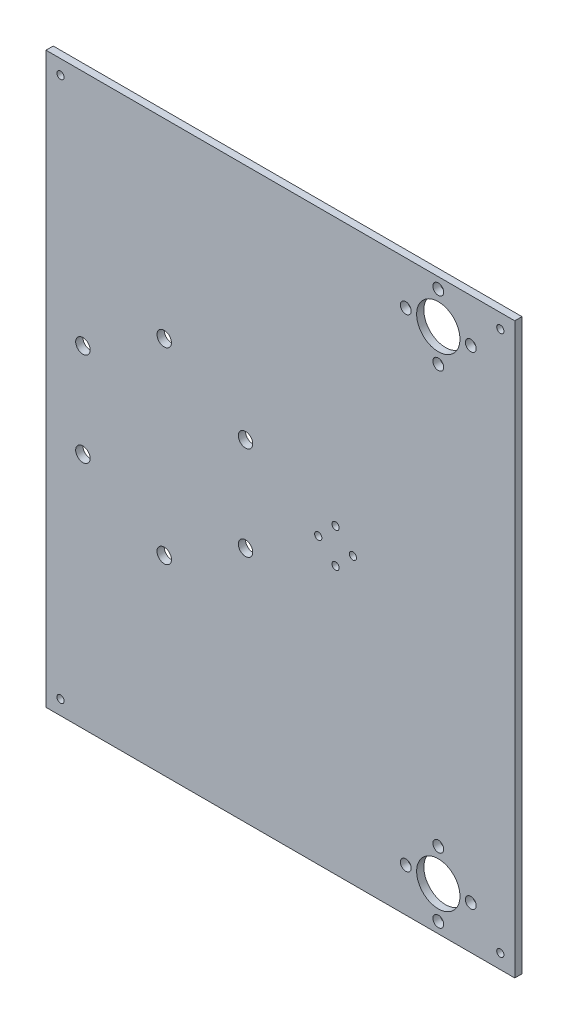
ISO-10303-21;
HEADER;
FILE_DESCRIPTION(('STEP AP214'),'2;1');
FILE_NAME('part.step','',(''),(''),'','','');
FILE_SCHEMA(('AUTOMOTIVE_DESIGN { 1 0 10303 214 1 1 1 1 }'));
ENDSEC;
DATA;
#1=APPLICATION_CONTEXT('core data for automotive mechanical design processes');
#2=APPLICATION_PROTOCOL_DEFINITION('international standard','automotive_design',2000,#1);
#3=PRODUCT_CONTEXT('',#1,'mechanical');
#4=PRODUCT('Part','Part','',(#3));
#5=PRODUCT_RELATED_PRODUCT_CATEGORY('part','',(#4));
#6=PRODUCT_DEFINITION_FORMATION('','',#4);
#7=PRODUCT_DEFINITION_CONTEXT('part definition',#1,'design');
#8=PRODUCT_DEFINITION('design','',#6,#7);
#9=PRODUCT_DEFINITION_SHAPE('','',#8);
#10=(LENGTH_UNIT() NAMED_UNIT(*) SI_UNIT(.MILLI.,.METRE.));
#11=(NAMED_UNIT(*) PLANE_ANGLE_UNIT() SI_UNIT($,.RADIAN.));
#12=(NAMED_UNIT(*) SI_UNIT($,.STERADIAN.) SOLID_ANGLE_UNIT());
#13=UNCERTAINTY_MEASURE_WITH_UNIT(LENGTH_MEASURE(1.E-05),#10,'distance_accuracy_value','');
#14=(GEOMETRIC_REPRESENTATION_CONTEXT(3) GLOBAL_UNCERTAINTY_ASSIGNED_CONTEXT((#13)) GLOBAL_UNIT_ASSIGNED_CONTEXT((#10,
#11,#12)) REPRESENTATION_CONTEXT('',''));
#15=CARTESIAN_POINT('',(0.,0.,0.));
#16=DIRECTION('',(0.,0.,1.));
#17=DIRECTION('',(1.,0.,0.));
#18=AXIS2_PLACEMENT_3D('',#15,#16,#17);
#19=CARTESIAN_POINT('',(162.25,197.,5.));
#20=DIRECTION('',(-1.,0.,0.));
#21=DIRECTION('',(0.,-1.,0.));
#22=AXIS2_PLACEMENT_3D('',#19,#20,#21);
#23=PLANE('',#22);
#24=DIRECTION('',(0.,1.,0.));
#25=VECTOR('',#24,1.);
#26=CARTESIAN_POINT('',(162.25,197.,0.));
#27=LINE('',#26,#25);
#28=CARTESIAN_POINT('',(162.25,-197.,0.));
#29=VERTEX_POINT('',#28);
#30=CARTESIAN_POINT('',(162.25,197.,0.));
#31=VERTEX_POINT('',#30);
#32=EDGE_CURVE('E97',#29,#31,#27,.T.);
#33=ORIENTED_EDGE('',*,*,#32,.T.);
#34=DIRECTION('',(0.,0.,-1.));
#35=VECTOR('',#34,1.);
#36=CARTESIAN_POINT('',(162.25,197.,5.));
#37=LINE('',#36,#35);
#38=CARTESIAN_POINT('',(162.25,197.,5.));
#39=VERTEX_POINT('',#38);
#40=EDGE_CURVE('E11',#39,#31,#37,.T.);
#41=ORIENTED_EDGE('',*,*,#40,.F.);
#42=DIRECTION('',(0.,1.,0.));
#43=VECTOR('',#42,1.);
#44=CARTESIAN_POINT('',(162.25,197.,5.));
#45=LINE('',#44,#43);
#46=CARTESIAN_POINT('',(162.25,-197.,5.));
#47=VERTEX_POINT('',#46);
#48=EDGE_CURVE('E85',#47,#39,#45,.T.);
#49=ORIENTED_EDGE('',*,*,#48,.F.);
#50=DIRECTION('',(0.,0.,-1.));
#51=VECTOR('',#50,1.);
#52=CARTESIAN_POINT('',(162.25,-197.,5.));
#53=LINE('',#52,#51);
#54=EDGE_CURVE('E93',#47,#29,#53,.T.);
#55=ORIENTED_EDGE('',*,*,#54,.T.);
#56=EDGE_LOOP('',(#33,#41,#49,#55));
#57=FACE_BOUND('',#56,.T.);
#58=ADVANCED_FACE('F34',(#57),#23,.F.);
#59=CARTESIAN_POINT('',(-162.25,197.,5.));
#60=DIRECTION('',(0.,-1.,0.));
#61=DIRECTION('',(0.,0.,-1.));
#62=AXIS2_PLACEMENT_3D('',#59,#60,#61);
#63=PLANE('',#62);
#64=DIRECTION('',(-1.,0.,0.));
#65=VECTOR('',#64,1.);
#66=CARTESIAN_POINT('',(-162.25,197.,0.));
#67=LINE('',#66,#65);
#68=CARTESIAN_POINT('',(-162.25,197.,0.));
#69=VERTEX_POINT('',#68);
#70=EDGE_CURVE('E89',#31,#69,#67,.T.);
#71=ORIENTED_EDGE('',*,*,#70,.T.);
#72=DIRECTION('',(0.,0.,-1.));
#73=VECTOR('',#72,1.);
#74=CARTESIAN_POINT('',(-162.25,197.,5.));
#75=LINE('',#74,#73);
#76=CARTESIAN_POINT('',(-162.25,197.,5.));
#77=VERTEX_POINT('',#76);
#78=EDGE_CURVE('E42',#77,#69,#75,.T.);
#79=ORIENTED_EDGE('',*,*,#78,.F.);
#80=DIRECTION('',(-1.,0.,0.));
#81=VECTOR('',#80,1.);
#82=CARTESIAN_POINT('',(-162.25,197.,5.));
#83=LINE('',#82,#81);
#84=EDGE_CURVE('E80',#39,#77,#83,.T.);
#85=ORIENTED_EDGE('',*,*,#84,.F.);
#86=ORIENTED_EDGE('',*,*,#40,.T.);
#87=EDGE_LOOP('',(#71,#79,#85,#86));
#88=FACE_BOUND('',#87,.T.);
#89=ADVANCED_FACE('F88',(#88),#63,.F.);
#90=CARTESIAN_POINT('',(-162.25,197.,5.));
#91=DIRECTION('',(1.,0.,0.));
#92=DIRECTION('',(0.,1.,0.));
#93=AXIS2_PLACEMENT_3D('',#90,#91,#92);
#94=PLANE('',#93);
#95=DIRECTION('',(0.,-1.,0.));
#96=VECTOR('',#95,1.);
#97=CARTESIAN_POINT('',(-162.25,197.,0.));
#98=LINE('',#97,#96);
#99=CARTESIAN_POINT('',(-162.25,-197.,0.));
#100=VERTEX_POINT('',#99);
#101=EDGE_CURVE('E67',#69,#100,#98,.T.);
#102=ORIENTED_EDGE('',*,*,#101,.T.);
#103=DIRECTION('',(0.,0.,-1.));
#104=VECTOR('',#103,1.);
#105=CARTESIAN_POINT('',(-162.25,-197.,5.));
#106=LINE('',#105,#104);
#107=CARTESIAN_POINT('',(-162.25,-197.,5.));
#108=VERTEX_POINT('',#107);
#109=EDGE_CURVE('E90',#108,#100,#106,.T.);
#110=ORIENTED_EDGE('',*,*,#109,.F.);
#111=DIRECTION('',(0.,-1.,0.));
#112=VECTOR('',#111,1.);
#113=CARTESIAN_POINT('',(-162.25,197.,5.));
#114=LINE('',#113,#112);
#115=EDGE_CURVE('E83',#77,#108,#114,.T.);
#116=ORIENTED_EDGE('',*,*,#115,.F.);
#117=ORIENTED_EDGE('',*,*,#78,.T.);
#118=EDGE_LOOP('',(#102,#110,#116,#117));
#119=FACE_BOUND('',#118,.T.);
#120=ADVANCED_FACE('F91',(#119),#94,.F.);
#121=CARTESIAN_POINT('',(-162.25,-197.,5.));
#122=DIRECTION('',(0.,1.,0.));
#123=DIRECTION('',(0.,0.,1.));
#124=AXIS2_PLACEMENT_3D('',#121,#122,#123);
#125=PLANE('',#124);
#126=DIRECTION('',(1.,0.,0.));
#127=VECTOR('',#126,1.);
#128=CARTESIAN_POINT('',(-162.25,-197.,0.));
#129=LINE('',#128,#127);
#130=EDGE_CURVE('E73',#100,#29,#129,.T.);
#131=ORIENTED_EDGE('',*,*,#130,.T.);
#132=ORIENTED_EDGE('',*,*,#54,.F.);
#133=DIRECTION('',(1.,0.,0.));
#134=VECTOR('',#133,1.);
#135=CARTESIAN_POINT('',(-162.25,-197.,5.));
#136=LINE('',#135,#134);
#137=EDGE_CURVE('E50',#108,#47,#136,.T.);
#138=ORIENTED_EDGE('',*,*,#137,.F.);
#139=ORIENTED_EDGE('',*,*,#109,.T.);
#140=EDGE_LOOP('',(#131,#132,#138,#139));
#141=FACE_BOUND('',#140,.T.);
#142=ADVANCED_FACE('F105',(#141),#125,.F.);
#143=CARTESIAN_POINT('',(0.,0.,5.));
#144=DIRECTION('',(0.,0.,1.));
#145=DIRECTION('',(1.,0.,0.));
#146=AXIS2_PLACEMENT_3D('',#143,#144,#145);
#147=PLANE('',#146);
#148=CARTESIAN_POINT('',(109.309999999999,144.5,5.));
#149=DIRECTION('',(0.,0.,-1.));
#150=DIRECTION('',(-1.,0.,0.));
#151=AXIS2_PLACEMENT_3D('',#148,#149,#150);
#152=CIRCLE('',#151,3.75000000000001);
#153=CARTESIAN_POINT('',(105.559999999999,144.5,5.));
#154=VERTEX_POINT('',#153);
#155=EDGE_CURVE('E228',#154,#154,#152,.T.);
#156=ORIENTED_EDGE('',*,*,#155,.T.);
#157=EDGE_LOOP('',(#156));
#158=FACE_BOUND('',#157,.T.);
#159=CARTESIAN_POINT('',(86.8099999999996,167.,5.));
#160=DIRECTION('',(0.,0.,-1.));
#161=DIRECTION('',(-1.,0.,0.));
#162=AXIS2_PLACEMENT_3D('',#159,#160,#161);
#163=CIRCLE('',#162,3.75000000000001);
#164=CARTESIAN_POINT('',(83.0599999999996,167.,5.));
#165=VERTEX_POINT('',#164);
#166=EDGE_CURVE('E235',#165,#165,#163,.T.);
#167=ORIENTED_EDGE('',*,*,#166,.T.);
#168=EDGE_LOOP('',(#167));
#169=FACE_BOUND('',#168,.T.);
#170=CARTESIAN_POINT('',(131.81,-167.,5.));
#171=DIRECTION('',(0.,0.,-1.));
#172=DIRECTION('',(-1.,0.,0.));
#173=AXIS2_PLACEMENT_3D('',#170,#171,#172);
#174=CIRCLE('',#173,3.75000000000001);
#175=CARTESIAN_POINT('',(128.06,-167.,5.));
#176=VERTEX_POINT('',#175);
#177=EDGE_CURVE('E241',#176,#176,#174,.T.);
#178=ORIENTED_EDGE('',*,*,#177,.T.);
#179=EDGE_LOOP('',(#178));
#180=FACE_BOUND('',#179,.T.);
#181=CARTESIAN_POINT('',(109.309999999999,-189.5,5.));
#182=DIRECTION('',(0.,0.,-1.));
#183=DIRECTION('',(-1.,0.,0.));
#184=AXIS2_PLACEMENT_3D('',#181,#182,#183);
#185=CIRCLE('',#184,3.75000000000001);
#186=CARTESIAN_POINT('',(105.559999999999,-189.5,5.));
#187=VERTEX_POINT('',#186);
#188=EDGE_CURVE('E217',#187,#187,#185,.T.);
#189=ORIENTED_EDGE('',*,*,#188,.T.);
#190=EDGE_LOOP('',(#189));
#191=FACE_BOUND('',#190,.T.);
#192=CARTESIAN_POINT('',(109.31,-167.,5.));
#193=DIRECTION('',(0.,0.,-1.));
#194=DIRECTION('',(-1.,0.,0.));
#195=AXIS2_PLACEMENT_3D('',#192,#193,#194);
#196=CIRCLE('',#195,15.);
#197=CARTESIAN_POINT('',(94.3099999999999,-167.,5.));
#198=VERTEX_POINT('',#197);
#199=EDGE_CURVE('E198',#198,#198,#196,.T.);
#200=ORIENTED_EDGE('',*,*,#199,.T.);
#201=EDGE_LOOP('',(#200));
#202=FACE_BOUND('',#201,.T.);
#203=CARTESIAN_POINT('',(109.31,189.5,5.));
#204=DIRECTION('',(0.,0.,-1.));
#205=DIRECTION('',(-1.,0.,0.));
#206=AXIS2_PLACEMENT_3D('',#203,#204,#205);
#207=CIRCLE('',#206,3.75000000000001);
#208=CARTESIAN_POINT('',(105.56,189.5,5.));
#209=VERTEX_POINT('',#208);
#210=EDGE_CURVE('E204',#209,#209,#207,.T.);
#211=ORIENTED_EDGE('',*,*,#210,.T.);
#212=EDGE_LOOP('',(#211));
#213=FACE_BOUND('',#212,.T.);
#214=CARTESIAN_POINT('',(109.31,-144.5,5.));
#215=DIRECTION('',(0.,0.,-1.));
#216=DIRECTION('',(-1.,0.,0.));
#217=AXIS2_PLACEMENT_3D('',#214,#215,#216);
#218=CIRCLE('',#217,3.75000000000001);
#219=CARTESIAN_POINT('',(105.56,-144.5,5.));
#220=VERTEX_POINT('',#219);
#221=EDGE_CURVE('E205',#220,#220,#218,.T.);
#222=ORIENTED_EDGE('',*,*,#221,.T.);
#223=EDGE_LOOP('',(#222));
#224=FACE_BOUND('',#223,.T.);
#225=CARTESIAN_POINT('',(86.8099999999996,-167.,5.));
#226=DIRECTION('',(0.,0.,-1.));
#227=DIRECTION('',(-1.,0.,0.));
#228=AXIS2_PLACEMENT_3D('',#225,#226,#227);
#229=CIRCLE('',#228,3.75000000000001);
#230=CARTESIAN_POINT('',(83.0599999999996,-167.,5.));
#231=VERTEX_POINT('',#230);
#232=EDGE_CURVE('E216',#231,#231,#229,.T.);
#233=ORIENTED_EDGE('',*,*,#232,.T.);
#234=EDGE_LOOP('',(#233));
#235=FACE_BOUND('',#234,.T.);
#236=CARTESIAN_POINT('',(131.81,167.,5.));
#237=DIRECTION('',(0.,0.,-1.));
#238=DIRECTION('',(-1.,0.,0.));
#239=AXIS2_PLACEMENT_3D('',#236,#237,#238);
#240=CIRCLE('',#239,3.75000000000001);
#241=CARTESIAN_POINT('',(128.06,167.,5.));
#242=VERTEX_POINT('',#241);
#243=EDGE_CURVE('E229',#242,#242,#240,.T.);
#244=ORIENTED_EDGE('',*,*,#243,.T.);
#245=EDGE_LOOP('',(#244));
#246=FACE_BOUND('',#245,.T.);
#247=CARTESIAN_POINT('',(109.31,167.,5.));
#248=DIRECTION('',(0.,0.,-1.));
#249=DIRECTION('',(-1.,0.,0.));
#250=AXIS2_PLACEMENT_3D('',#247,#248,#249);
#251=CIRCLE('',#250,15.);
#252=CARTESIAN_POINT('',(94.3099999999999,167.,5.));
#253=VERTEX_POINT('',#252);
#254=EDGE_CURVE('E175',#253,#253,#251,.T.);
#255=ORIENTED_EDGE('',*,*,#254,.T.);
#256=EDGE_LOOP('',(#255));
#257=FACE_BOUND('',#256,.T.);
#258=CARTESIAN_POINT('',(38.192392444615,12.,5.));
#259=DIRECTION('',(0.,0.,1.));
#260=DIRECTION('',(1.,0.,0.));
#261=AXIS2_PLACEMENT_3D('',#258,#259,#260);
#262=CIRCLE('',#261,2.5);
#263=CARTESIAN_POINT('',(40.692392444615,12.,5.));
#264=VERTEX_POINT('',#263);
#265=EDGE_CURVE('E190',#264,#264,#262,.T.);
#266=ORIENTED_EDGE('',*,*,#265,.F.);
#267=EDGE_LOOP('',(#266));
#268=FACE_BOUND('',#267,.T.);
#269=CARTESIAN_POINT('',(50.1923924446153,2.98372437868011E-13,5.));
#270=DIRECTION('',(0.,0.,1.));
#271=DIRECTION('',(1.,0.,0.));
#272=AXIS2_PLACEMENT_3D('',#269,#270,#271);
#273=CIRCLE('',#272,2.5);
#274=CARTESIAN_POINT('',(52.6923924446153,2.98372437868011E-13,5.));
#275=VERTEX_POINT('',#274);
#276=EDGE_CURVE('E184',#275,#275,#273,.T.);
#277=ORIENTED_EDGE('',*,*,#276,.F.);
#278=EDGE_LOOP('',(#277));
#279=FACE_BOUND('',#278,.T.);
#280=CARTESIAN_POINT('',(38.1923924446156,-12.,5.));
#281=DIRECTION('',(0.,0.,1.));
#282=DIRECTION('',(1.,0.,0.));
#283=AXIS2_PLACEMENT_3D('',#280,#281,#282);
#284=CIRCLE('',#283,2.5);
#285=CARTESIAN_POINT('',(40.6923924446156,-12.,5.));
#286=VERTEX_POINT('',#285);
#287=EDGE_CURVE('E178',#286,#286,#284,.T.);
#288=ORIENTED_EDGE('',*,*,#287,.F.);
#289=EDGE_LOOP('',(#288));
#290=FACE_BOUND('',#289,.T.);
#291=CARTESIAN_POINT('',(26.1923924446153,-2.15105711021124E-13,5.));
#292=DIRECTION('',(0.,0.,1.));
#293=DIRECTION('',(1.,0.,0.));
#294=AXIS2_PLACEMENT_3D('',#291,#292,#293);
#295=CIRCLE('',#294,2.5);
#296=CARTESIAN_POINT('',(28.6923924446153,-2.15105711021124E-13,5.));
#297=VERTEX_POINT('',#296);
#298=EDGE_CURVE('E171',#297,#297,#295,.T.);
#299=ORIENTED_EDGE('',*,*,#298,.F.);
#300=EDGE_LOOP('',(#299));
#301=FACE_BOUND('',#300,.T.);
#302=CARTESIAN_POINT('',(-80.4222152319038,65.,5.));
#303=DIRECTION('',(0.,0.,-1.));
#304=DIRECTION('',(-1.,0.,0.));
#305=AXIS2_PLACEMENT_3D('',#302,#303,#304);
#306=CIRCLE('',#305,5.00000000000001);
#307=CARTESIAN_POINT('',(-85.4222152319038,65.,5.));
#308=VERTEX_POINT('',#307);
#309=EDGE_CURVE('E121',#308,#308,#306,.T.);
#310=ORIENTED_EDGE('',*,*,#309,.T.);
#311=EDGE_LOOP('',(#310));
#312=FACE_BOUND('',#311,.T.);
#313=CARTESIAN_POINT('',(-24.1305639859166,32.4999999999991,5.));
#314=DIRECTION('',(0.,0.,-1.));
#315=DIRECTION('',(-1.,0.,0.));
#316=AXIS2_PLACEMENT_3D('',#313,#314,#315);
#317=CIRCLE('',#316,5.00000000000001);
#318=CARTESIAN_POINT('',(-29.1305639859166,32.4999999999991,5.));
#319=VERTEX_POINT('',#318);
#320=EDGE_CURVE('E139',#319,#319,#317,.T.);
#321=ORIENTED_EDGE('',*,*,#320,.T.);
#322=EDGE_LOOP('',(#321));
#323=FACE_BOUND('',#322,.T.);
#324=CARTESIAN_POINT('',(-24.1305639859178,-32.5000000000011,5.));
#325=DIRECTION('',(0.,0.,-1.));
#326=DIRECTION('',(-1.,0.,0.));
#327=AXIS2_PLACEMENT_3D('',#324,#325,#326);
#328=CIRCLE('',#327,5.);
#329=CARTESIAN_POINT('',(-29.1305639859178,-32.5000000000011,5.));
#330=VERTEX_POINT('',#329);
#331=EDGE_CURVE('E138',#330,#330,#328,.T.);
#332=ORIENTED_EDGE('',*,*,#331,.T.);
#333=EDGE_LOOP('',(#332));
#334=FACE_BOUND('',#333,.T.);
#335=CARTESIAN_POINT('',(-80.422215231907,-65.,5.));
#336=DIRECTION('',(0.,0.,-1.));
#337=DIRECTION('',(-1.,0.,0.));
#338=AXIS2_PLACEMENT_3D('',#335,#336,#337);
#339=CIRCLE('',#338,4.99999999999999);
#340=CARTESIAN_POINT('',(-85.422215231907,-65.,5.));
#341=VERTEX_POINT('',#340);
#342=EDGE_CURVE('E145',#341,#341,#339,.T.);
#343=ORIENTED_EDGE('',*,*,#342,.T.);
#344=EDGE_LOOP('',(#343));
#345=FACE_BOUND('',#344,.T.);
#346=CARTESIAN_POINT('',(-136.713866477895,-32.4999999999987,5.));
#347=DIRECTION('',(0.,0.,-1.));
#348=DIRECTION('',(-1.,0.,0.));
#349=AXIS2_PLACEMENT_3D('',#346,#347,#348);
#350=CIRCLE('',#349,5.);
#351=CARTESIAN_POINT('',(-141.713866477895,-32.4999999999987,5.));
#352=VERTEX_POINT('',#351);
#353=EDGE_CURVE('E151',#352,#352,#350,.T.);
#354=ORIENTED_EDGE('',*,*,#353,.T.);
#355=EDGE_LOOP('',(#354));
#356=FACE_BOUND('',#355,.T.);
#357=CARTESIAN_POINT('',(-136.713866477893,32.5000000000014,5.));
#358=DIRECTION('',(0.,0.,-1.));
#359=DIRECTION('',(-1.,0.,0.));
#360=AXIS2_PLACEMENT_3D('',#357,#358,#359);
#361=CIRCLE('',#360,5.);
#362=CARTESIAN_POINT('',(-141.713866477893,32.5000000000014,5.));
#363=VERTEX_POINT('',#362);
#364=EDGE_CURVE('E157',#363,#363,#361,.T.);
#365=ORIENTED_EDGE('',*,*,#364,.T.);
#366=EDGE_LOOP('',(#365));
#367=FACE_BOUND('',#366,.T.);
#368=CARTESIAN_POINT('',(152.25,-187.,5.));
#369=DIRECTION('',(0.,0.,1.));
#370=DIRECTION('',(1.,0.,0.));
#371=AXIS2_PLACEMENT_3D('',#368,#369,#370);
#372=CIRCLE('',#371,2.5);
#373=CARTESIAN_POINT('',(154.75,-187.,5.));
#374=VERTEX_POINT('',#373);
#375=EDGE_CURVE('E117',#374,#374,#372,.T.);
#376=ORIENTED_EDGE('',*,*,#375,.F.);
#377=EDGE_LOOP('',(#376));
#378=FACE_BOUND('',#377,.T.);
#379=CARTESIAN_POINT('',(-152.25,-187.,5.));
#380=DIRECTION('',(0.,0.,1.));
#381=DIRECTION('',(1.,0.,0.));
#382=AXIS2_PLACEMENT_3D('',#379,#380,#381);
#383=CIRCLE('',#382,2.5);
#384=CARTESIAN_POINT('',(-149.75,-187.,5.));
#385=VERTEX_POINT('',#384);
#386=EDGE_CURVE('E124',#385,#385,#383,.T.);
#387=ORIENTED_EDGE('',*,*,#386,.F.);
#388=EDGE_LOOP('',(#387));
#389=FACE_BOUND('',#388,.T.);
#390=CARTESIAN_POINT('',(-152.25,187.,5.));
#391=DIRECTION('',(0.,0.,1.));
#392=DIRECTION('',(1.,0.,0.));
#393=AXIS2_PLACEMENT_3D('',#390,#391,#392);
#394=CIRCLE('',#393,2.5);
#395=CARTESIAN_POINT('',(-149.75,187.,5.));
#396=VERTEX_POINT('',#395);
#397=EDGE_CURVE('E130',#396,#396,#394,.T.);
#398=ORIENTED_EDGE('',*,*,#397,.F.);
#399=EDGE_LOOP('',(#398));
#400=FACE_BOUND('',#399,.T.);
#401=CARTESIAN_POINT('',(152.25,187.,5.));
#402=DIRECTION('',(0.,0.,1.));
#403=DIRECTION('',(1.,0.,0.));
#404=AXIS2_PLACEMENT_3D('',#401,#402,#403);
#405=CIRCLE('',#404,2.5);
#406=CARTESIAN_POINT('',(154.75,187.,5.));
#407=VERTEX_POINT('',#406);
#408=EDGE_CURVE('E111',#407,#407,#405,.T.);
#409=ORIENTED_EDGE('',*,*,#408,.F.);
#410=EDGE_LOOP('',(#409));
#411=FACE_BOUND('',#410,.T.);
#412=ORIENTED_EDGE('',*,*,#48,.T.);
#413=ORIENTED_EDGE('',*,*,#84,.T.);
#414=ORIENTED_EDGE('',*,*,#115,.T.);
#415=ORIENTED_EDGE('',*,*,#137,.T.);
#416=EDGE_LOOP('',(#412,#413,#414,#415));
#417=FACE_BOUND('',#416,.T.);
#418=ADVANCED_FACE('F81',(#158,#169,#180,#191,#202,#213,#224,#235,#246,#257,#268,#279,#290,#301,
#312,#323,#334,#345,#356,#367,#378,#389,#400,#411,#417),#147,.T.);
#419=CARTESIAN_POINT('',(0.,0.,0.));
#420=DIRECTION('',(0.,0.,1.));
#421=DIRECTION('',(1.,0.,0.));
#422=AXIS2_PLACEMENT_3D('',#419,#420,#421);
#423=PLANE('',#422);
#424=CARTESIAN_POINT('',(109.309999999999,144.5,0.));
#425=DIRECTION('',(0.,0.,-1.));
#426=DIRECTION('',(-1.,0.,0.));
#427=AXIS2_PLACEMENT_3D('',#424,#425,#426);
#428=CIRCLE('',#427,3.75000000000001);
#429=CARTESIAN_POINT('',(105.559999999999,144.5,0.));
#430=VERTEX_POINT('',#429);
#431=EDGE_CURVE('E225',#430,#430,#428,.T.);
#432=ORIENTED_EDGE('',*,*,#431,.F.);
#433=EDGE_LOOP('',(#432));
#434=FACE_BOUND('',#433,.T.);
#435=CARTESIAN_POINT('',(86.8099999999996,167.,0.));
#436=DIRECTION('',(0.,0.,-1.));
#437=DIRECTION('',(-1.,0.,0.));
#438=AXIS2_PLACEMENT_3D('',#435,#436,#437);
#439=CIRCLE('',#438,3.75000000000001);
#440=CARTESIAN_POINT('',(83.0599999999996,167.,0.));
#441=VERTEX_POINT('',#440);
#442=EDGE_CURVE('E232',#441,#441,#439,.T.);
#443=ORIENTED_EDGE('',*,*,#442,.F.);
#444=EDGE_LOOP('',(#443));
#445=FACE_BOUND('',#444,.T.);
#446=CARTESIAN_POINT('',(131.81,-167.,0.));
#447=DIRECTION('',(0.,0.,-1.));
#448=DIRECTION('',(-1.,0.,0.));
#449=AXIS2_PLACEMENT_3D('',#446,#447,#448);
#450=CIRCLE('',#449,3.75000000000001);
#451=CARTESIAN_POINT('',(128.06,-167.,0.));
#452=VERTEX_POINT('',#451);
#453=EDGE_CURVE('E238',#452,#452,#450,.T.);
#454=ORIENTED_EDGE('',*,*,#453,.F.);
#455=EDGE_LOOP('',(#454));
#456=FACE_BOUND('',#455,.T.);
#457=CARTESIAN_POINT('',(109.309999999999,-189.5,0.));
#458=DIRECTION('',(0.,0.,-1.));
#459=DIRECTION('',(-1.,0.,0.));
#460=AXIS2_PLACEMENT_3D('',#457,#458,#459);
#461=CIRCLE('',#460,3.75000000000001);
#462=CARTESIAN_POINT('',(105.559999999999,-189.5,0.));
#463=VERTEX_POINT('',#462);
#464=EDGE_CURVE('E244',#463,#463,#461,.T.);
#465=ORIENTED_EDGE('',*,*,#464,.F.);
#466=EDGE_LOOP('',(#465));
#467=FACE_BOUND('',#466,.T.);
#468=CARTESIAN_POINT('',(109.31,-167.,0.));
#469=DIRECTION('',(0.,0.,-1.));
#470=DIRECTION('',(-1.,0.,0.));
#471=AXIS2_PLACEMENT_3D('',#468,#469,#470);
#472=CIRCLE('',#471,15.);
#473=CARTESIAN_POINT('',(94.3099999999999,-167.,0.));
#474=VERTEX_POINT('',#473);
#475=EDGE_CURVE('E208',#474,#474,#472,.T.);
#476=ORIENTED_EDGE('',*,*,#475,.F.);
#477=EDGE_LOOP('',(#476));
#478=FACE_BOUND('',#477,.T.);
#479=CARTESIAN_POINT('',(109.31,189.5,0.));
#480=DIRECTION('',(0.,0.,-1.));
#481=DIRECTION('',(-1.,0.,0.));
#482=AXIS2_PLACEMENT_3D('',#479,#480,#481);
#483=CIRCLE('',#482,3.75000000000001);
#484=CARTESIAN_POINT('',(105.56,189.5,0.));
#485=VERTEX_POINT('',#484);
#486=EDGE_CURVE('E201',#485,#485,#483,.T.);
#487=ORIENTED_EDGE('',*,*,#486,.F.);
#488=EDGE_LOOP('',(#487));
#489=FACE_BOUND('',#488,.T.);
#490=CARTESIAN_POINT('',(109.31,-144.5,0.));
#491=DIRECTION('',(0.,0.,-1.));
#492=DIRECTION('',(-1.,0.,0.));
#493=AXIS2_PLACEMENT_3D('',#490,#491,#492);
#494=CIRCLE('',#493,3.75000000000001);
#495=CARTESIAN_POINT('',(105.56,-144.5,0.));
#496=VERTEX_POINT('',#495);
#497=EDGE_CURVE('E220',#496,#496,#494,.T.);
#498=ORIENTED_EDGE('',*,*,#497,.F.);
#499=EDGE_LOOP('',(#498));
#500=FACE_BOUND('',#499,.T.);
#501=CARTESIAN_POINT('',(86.8099999999996,-167.,0.));
#502=DIRECTION('',(0.,0.,-1.));
#503=DIRECTION('',(-1.,0.,0.));
#504=AXIS2_PLACEMENT_3D('',#501,#502,#503);
#505=CIRCLE('',#504,3.75000000000001);
#506=CARTESIAN_POINT('',(83.0599999999996,-167.,0.));
#507=VERTEX_POINT('',#506);
#508=EDGE_CURVE('E213',#507,#507,#505,.T.);
#509=ORIENTED_EDGE('',*,*,#508,.F.);
#510=EDGE_LOOP('',(#509));
#511=FACE_BOUND('',#510,.T.);
#512=CARTESIAN_POINT('',(131.81,167.,0.));
#513=DIRECTION('',(0.,0.,-1.));
#514=DIRECTION('',(-1.,0.,0.));
#515=AXIS2_PLACEMENT_3D('',#512,#513,#514);
#516=CIRCLE('',#515,3.75000000000001);
#517=CARTESIAN_POINT('',(128.06,167.,0.));
#518=VERTEX_POINT('',#517);
#519=EDGE_CURVE('E249',#518,#518,#516,.T.);
#520=ORIENTED_EDGE('',*,*,#519,.F.);
#521=EDGE_LOOP('',(#520));
#522=FACE_BOUND('',#521,.T.);
#523=CARTESIAN_POINT('',(109.31,167.,0.));
#524=DIRECTION('',(0.,0.,-1.));
#525=DIRECTION('',(-1.,0.,0.));
#526=AXIS2_PLACEMENT_3D('',#523,#524,#525);
#527=CIRCLE('',#526,15.);
#528=CARTESIAN_POINT('',(94.3099999999999,167.,0.));
#529=VERTEX_POINT('',#528);
#530=EDGE_CURVE('E195',#529,#529,#527,.T.);
#531=ORIENTED_EDGE('',*,*,#530,.F.);
#532=EDGE_LOOP('',(#531));
#533=FACE_BOUND('',#532,.T.);
#534=CARTESIAN_POINT('',(38.192392444615,12.,0.));
#535=DIRECTION('',(0.,0.,1.));
#536=DIRECTION('',(1.,0.,0.));
#537=AXIS2_PLACEMENT_3D('',#534,#535,#536);
#538=CIRCLE('',#537,2.5);
#539=CARTESIAN_POINT('',(40.692392444615,12.,0.));
#540=VERTEX_POINT('',#539);
#541=EDGE_CURVE('E164',#540,#540,#538,.T.);
#542=ORIENTED_EDGE('',*,*,#541,.T.);
#543=EDGE_LOOP('',(#542));
#544=FACE_BOUND('',#543,.T.);
#545=CARTESIAN_POINT('',(50.1923924446153,2.98372437868011E-13,0.));
#546=DIRECTION('',(0.,0.,1.));
#547=DIRECTION('',(1.,0.,0.));
#548=AXIS2_PLACEMENT_3D('',#545,#546,#547);
#549=CIRCLE('',#548,2.5);
#550=CARTESIAN_POINT('',(52.6923924446153,2.98372437868011E-13,0.));
#551=VERTEX_POINT('',#550);
#552=EDGE_CURVE('E187',#551,#551,#549,.T.);
#553=ORIENTED_EDGE('',*,*,#552,.T.);
#554=EDGE_LOOP('',(#553));
#555=FACE_BOUND('',#554,.T.);
#556=CARTESIAN_POINT('',(38.1923924446156,-12.,0.));
#557=DIRECTION('',(0.,0.,1.));
#558=DIRECTION('',(1.,0.,0.));
#559=AXIS2_PLACEMENT_3D('',#556,#557,#558);
#560=CIRCLE('',#559,2.5);
#561=CARTESIAN_POINT('',(40.6923924446156,-12.,0.));
#562=VERTEX_POINT('',#561);
#563=EDGE_CURVE('E181',#562,#562,#560,.T.);
#564=ORIENTED_EDGE('',*,*,#563,.T.);
#565=EDGE_LOOP('',(#564));
#566=FACE_BOUND('',#565,.T.);
#567=CARTESIAN_POINT('',(26.1923924446153,-2.15105711021124E-13,0.));
#568=DIRECTION('',(0.,0.,1.));
#569=DIRECTION('',(1.,0.,0.));
#570=AXIS2_PLACEMENT_3D('',#567,#568,#569);
#571=CIRCLE('',#570,2.5);
#572=CARTESIAN_POINT('',(28.6923924446153,-2.15105711021124E-13,0.));
#573=VERTEX_POINT('',#572);
#574=EDGE_CURVE('E174',#573,#573,#571,.T.);
#575=ORIENTED_EDGE('',*,*,#574,.T.);
#576=EDGE_LOOP('',(#575));
#577=FACE_BOUND('',#576,.T.);
#578=CARTESIAN_POINT('',(-80.4222152319038,65.,0.));
#579=DIRECTION('',(0.,0.,-1.));
#580=DIRECTION('',(-1.,0.,0.));
#581=AXIS2_PLACEMENT_3D('',#578,#579,#580);
#582=CIRCLE('',#581,5.00000000000001);
#583=CARTESIAN_POINT('',(-85.4222152319038,65.,0.));
#584=VERTEX_POINT('',#583);
#585=EDGE_CURVE('E160',#584,#584,#582,.T.);
#586=ORIENTED_EDGE('',*,*,#585,.F.);
#587=EDGE_LOOP('',(#586));
#588=FACE_BOUND('',#587,.T.);
#589=CARTESIAN_POINT('',(-24.1305639859166,32.4999999999991,0.));
#590=DIRECTION('',(0.,0.,-1.));
#591=DIRECTION('',(-1.,0.,0.));
#592=AXIS2_PLACEMENT_3D('',#589,#590,#591);
#593=CIRCLE('',#592,5.00000000000001);
#594=CARTESIAN_POINT('',(-29.1305639859166,32.4999999999991,0.));
#595=VERTEX_POINT('',#594);
#596=EDGE_CURVE('E161',#595,#595,#593,.T.);
#597=ORIENTED_EDGE('',*,*,#596,.F.);
#598=EDGE_LOOP('',(#597));
#599=FACE_BOUND('',#598,.T.);
#600=CARTESIAN_POINT('',(-24.1305639859178,-32.5000000000011,0.));
#601=DIRECTION('',(0.,0.,-1.));
#602=DIRECTION('',(-1.,0.,0.));
#603=AXIS2_PLACEMENT_3D('',#600,#601,#602);
#604=CIRCLE('',#603,5.);
#605=CARTESIAN_POINT('',(-29.1305639859178,-32.5000000000011,0.));
#606=VERTEX_POINT('',#605);
#607=EDGE_CURVE('E135',#606,#606,#604,.T.);
#608=ORIENTED_EDGE('',*,*,#607,.F.);
#609=EDGE_LOOP('',(#608));
#610=FACE_BOUND('',#609,.T.);
#611=CARTESIAN_POINT('',(-80.422215231907,-65.,0.));
#612=DIRECTION('',(0.,0.,-1.));
#613=DIRECTION('',(-1.,0.,0.));
#614=AXIS2_PLACEMENT_3D('',#611,#612,#613);
#615=CIRCLE('',#614,4.99999999999999);
#616=CARTESIAN_POINT('',(-85.422215231907,-65.,0.));
#617=VERTEX_POINT('',#616);
#618=EDGE_CURVE('E142',#617,#617,#615,.T.);
#619=ORIENTED_EDGE('',*,*,#618,.F.);
#620=EDGE_LOOP('',(#619));
#621=FACE_BOUND('',#620,.T.);
#622=CARTESIAN_POINT('',(-136.713866477895,-32.4999999999987,0.));
#623=DIRECTION('',(0.,0.,-1.));
#624=DIRECTION('',(-1.,0.,0.));
#625=AXIS2_PLACEMENT_3D('',#622,#623,#624);
#626=CIRCLE('',#625,5.);
#627=CARTESIAN_POINT('',(-141.713866477895,-32.4999999999987,0.));
#628=VERTEX_POINT('',#627);
#629=EDGE_CURVE('E148',#628,#628,#626,.T.);
#630=ORIENTED_EDGE('',*,*,#629,.F.);
#631=EDGE_LOOP('',(#630));
#632=FACE_BOUND('',#631,.T.);
#633=CARTESIAN_POINT('',(-136.713866477893,32.5000000000014,0.));
#634=DIRECTION('',(0.,0.,-1.));
#635=DIRECTION('',(-1.,0.,0.));
#636=AXIS2_PLACEMENT_3D('',#633,#634,#635);
#637=CIRCLE('',#636,5.);
#638=CARTESIAN_POINT('',(-141.713866477893,32.5000000000014,0.));
#639=VERTEX_POINT('',#638);
#640=EDGE_CURVE('E154',#639,#639,#637,.T.);
#641=ORIENTED_EDGE('',*,*,#640,.F.);
#642=EDGE_LOOP('',(#641));
#643=FACE_BOUND('',#642,.T.);
#644=CARTESIAN_POINT('',(152.25,-187.,0.));
#645=DIRECTION('',(0.,0.,1.));
#646=DIRECTION('',(1.,0.,0.));
#647=AXIS2_PLACEMENT_3D('',#644,#645,#646);
#648=CIRCLE('',#647,2.5);
#649=CARTESIAN_POINT('',(154.75,-187.,0.));
#650=VERTEX_POINT('',#649);
#651=EDGE_CURVE('E120',#650,#650,#648,.T.);
#652=ORIENTED_EDGE('',*,*,#651,.T.);
#653=EDGE_LOOP('',(#652));
#654=FACE_BOUND('',#653,.T.);
#655=CARTESIAN_POINT('',(-152.25,-187.,0.));
#656=DIRECTION('',(0.,0.,1.));
#657=DIRECTION('',(1.,0.,0.));
#658=AXIS2_PLACEMENT_3D('',#655,#656,#657);
#659=CIRCLE('',#658,2.5);
#660=CARTESIAN_POINT('',(-149.75,-187.,0.));
#661=VERTEX_POINT('',#660);
#662=EDGE_CURVE('E127',#661,#661,#659,.T.);
#663=ORIENTED_EDGE('',*,*,#662,.T.);
#664=EDGE_LOOP('',(#663));
#665=FACE_BOUND('',#664,.T.);
#666=CARTESIAN_POINT('',(-152.25,187.,0.));
#667=DIRECTION('',(0.,0.,1.));
#668=DIRECTION('',(1.,0.,0.));
#669=AXIS2_PLACEMENT_3D('',#666,#667,#668);
#670=CIRCLE('',#669,2.5);
#671=CARTESIAN_POINT('',(-149.75,187.,0.));
#672=VERTEX_POINT('',#671);
#673=EDGE_CURVE('E114',#672,#672,#670,.T.);
#674=ORIENTED_EDGE('',*,*,#673,.T.);
#675=EDGE_LOOP('',(#674));
#676=FACE_BOUND('',#675,.T.);
#677=CARTESIAN_POINT('',(152.25,187.,0.));
#678=DIRECTION('',(0.,0.,1.));
#679=DIRECTION('',(1.,0.,0.));
#680=AXIS2_PLACEMENT_3D('',#677,#678,#679);
#681=CIRCLE('',#680,2.5);
#682=CARTESIAN_POINT('',(154.75,187.,0.));
#683=VERTEX_POINT('',#682);
#684=EDGE_CURVE('E100',#683,#683,#681,.T.);
#685=ORIENTED_EDGE('',*,*,#684,.T.);
#686=EDGE_LOOP('',(#685));
#687=FACE_BOUND('',#686,.T.);
#688=ORIENTED_EDGE('',*,*,#32,.F.);
#689=ORIENTED_EDGE('',*,*,#130,.F.);
#690=ORIENTED_EDGE('',*,*,#101,.F.);
#691=ORIENTED_EDGE('',*,*,#70,.F.);
#692=EDGE_LOOP('',(#688,#689,#690,#691));
#693=FACE_BOUND('',#692,.T.);
#694=ADVANCED_FACE('F108',(#434,#445,#456,#467,#478,#489,#500,#511,#522,#533,#544,#555,#566,
#577,#588,#599,#610,#621,#632,#643,#654,#665,#676,#687,#693),#423,.F.);
#695=CARTESIAN_POINT('',(152.25,187.,0.));
#696=DIRECTION('',(0.,0.,1.));
#697=DIRECTION('',(1.,0.,0.));
#698=AXIS2_PLACEMENT_3D('',#695,#696,#697);
#699=CYLINDRICAL_SURFACE('',#698,2.5);
#700=ORIENTED_EDGE('',*,*,#684,.F.);
#701=EDGE_LOOP('',(#700));
#702=FACE_BOUND('',#701,.T.);
#703=ORIENTED_EDGE('',*,*,#408,.T.);
#704=EDGE_LOOP('',(#703));
#705=FACE_BOUND('',#704,.T.);
#706=ADVANCED_FACE('F267',(#702,#705),#699,.F.);
#707=CARTESIAN_POINT('',(-152.25,187.,0.));
#708=DIRECTION('',(0.,0.,1.));
#709=DIRECTION('',(1.,0.,0.));
#710=AXIS2_PLACEMENT_3D('',#707,#708,#709);
#711=CYLINDRICAL_SURFACE('',#710,2.5);
#712=ORIENTED_EDGE('',*,*,#673,.F.);
#713=EDGE_LOOP('',(#712));
#714=FACE_BOUND('',#713,.T.);
#715=ORIENTED_EDGE('',*,*,#397,.T.);
#716=EDGE_LOOP('',(#715));
#717=FACE_BOUND('',#716,.T.);
#718=ADVANCED_FACE('F302',(#714,#717),#711,.F.);
#719=CARTESIAN_POINT('',(-152.25,-187.,0.));
#720=DIRECTION('',(0.,0.,1.));
#721=DIRECTION('',(1.,0.,0.));
#722=AXIS2_PLACEMENT_3D('',#719,#720,#721);
#723=CYLINDRICAL_SURFACE('',#722,2.5);
#724=ORIENTED_EDGE('',*,*,#662,.F.);
#725=EDGE_LOOP('',(#724));
#726=FACE_BOUND('',#725,.T.);
#727=ORIENTED_EDGE('',*,*,#386,.T.);
#728=EDGE_LOOP('',(#727));
#729=FACE_BOUND('',#728,.T.);
#730=ADVANCED_FACE('F345',(#726,#729),#723,.F.);
#731=CARTESIAN_POINT('',(152.25,-187.,0.));
#732=DIRECTION('',(0.,0.,1.));
#733=DIRECTION('',(1.,0.,0.));
#734=AXIS2_PLACEMENT_3D('',#731,#732,#733);
#735=CYLINDRICAL_SURFACE('',#734,2.5);
#736=ORIENTED_EDGE('',*,*,#651,.F.);
#737=EDGE_LOOP('',(#736));
#738=FACE_BOUND('',#737,.T.);
#739=ORIENTED_EDGE('',*,*,#375,.T.);
#740=EDGE_LOOP('',(#739));
#741=FACE_BOUND('',#740,.T.);
#742=ADVANCED_FACE('F355',(#738,#741),#735,.F.);
#743=CARTESIAN_POINT('',(-136.713866477893,32.5000000000014,5.));
#744=DIRECTION('',(0.,0.,-1.));
#745=DIRECTION('',(-1.,0.,0.));
#746=AXIS2_PLACEMENT_3D('',#743,#744,#745);
#747=CYLINDRICAL_SURFACE('',#746,5.);
#748=ORIENTED_EDGE('',*,*,#364,.F.);
#749=EDGE_LOOP('',(#748));
#750=FACE_BOUND('',#749,.T.);
#751=ORIENTED_EDGE('',*,*,#640,.T.);
#752=EDGE_LOOP('',(#751));
#753=FACE_BOUND('',#752,.T.);
#754=ADVANCED_FACE('F365',(#750,#753),#747,.F.);
#755=CARTESIAN_POINT('',(-136.713866477895,-32.4999999999987,5.));
#756=DIRECTION('',(0.,0.,-1.));
#757=DIRECTION('',(-1.,0.,0.));
#758=AXIS2_PLACEMENT_3D('',#755,#756,#757);
#759=CYLINDRICAL_SURFACE('',#758,5.);
#760=ORIENTED_EDGE('',*,*,#353,.F.);
#761=EDGE_LOOP('',(#760));
#762=FACE_BOUND('',#761,.T.);
#763=ORIENTED_EDGE('',*,*,#629,.T.);
#764=EDGE_LOOP('',(#763));
#765=FACE_BOUND('',#764,.T.);
#766=ADVANCED_FACE('F375',(#762,#765),#759,.F.);
#767=CARTESIAN_POINT('',(-80.422215231907,-65.,5.));
#768=DIRECTION('',(0.,0.,-1.));
#769=DIRECTION('',(-1.,0.,0.));
#770=AXIS2_PLACEMENT_3D('',#767,#768,#769);
#771=CYLINDRICAL_SURFACE('',#770,4.99999999999999);
#772=ORIENTED_EDGE('',*,*,#342,.F.);
#773=EDGE_LOOP('',(#772));
#774=FACE_BOUND('',#773,.T.);
#775=ORIENTED_EDGE('',*,*,#618,.T.);
#776=EDGE_LOOP('',(#775));
#777=FACE_BOUND('',#776,.T.);
#778=ADVANCED_FACE('F385',(#774,#777),#771,.F.);
#779=CARTESIAN_POINT('',(-24.1305639859178,-32.5000000000011,5.));
#780=DIRECTION('',(0.,0.,-1.));
#781=DIRECTION('',(-1.,0.,0.));
#782=AXIS2_PLACEMENT_3D('',#779,#780,#781);
#783=CYLINDRICAL_SURFACE('',#782,5.);
#784=ORIENTED_EDGE('',*,*,#331,.F.);
#785=EDGE_LOOP('',(#784));
#786=FACE_BOUND('',#785,.T.);
#787=ORIENTED_EDGE('',*,*,#607,.T.);
#788=EDGE_LOOP('',(#787));
#789=FACE_BOUND('',#788,.T.);
#790=ADVANCED_FACE('F395',(#786,#789),#783,.F.);
#791=CARTESIAN_POINT('',(-24.1305639859166,32.4999999999991,5.));
#792=DIRECTION('',(0.,0.,-1.));
#793=DIRECTION('',(-1.,0.,0.));
#794=AXIS2_PLACEMENT_3D('',#791,#792,#793);
#795=CYLINDRICAL_SURFACE('',#794,5.00000000000001);
#796=ORIENTED_EDGE('',*,*,#320,.F.);
#797=EDGE_LOOP('',(#796));
#798=FACE_BOUND('',#797,.T.);
#799=ORIENTED_EDGE('',*,*,#596,.T.);
#800=EDGE_LOOP('',(#799));
#801=FACE_BOUND('',#800,.T.);
#802=ADVANCED_FACE('F405',(#798,#801),#795,.F.);
#803=CARTESIAN_POINT('',(-80.4222152319038,65.,5.));
#804=DIRECTION('',(0.,0.,-1.));
#805=DIRECTION('',(-1.,0.,0.));
#806=AXIS2_PLACEMENT_3D('',#803,#804,#805);
#807=CYLINDRICAL_SURFACE('',#806,5.00000000000001);
#808=ORIENTED_EDGE('',*,*,#309,.F.);
#809=EDGE_LOOP('',(#808));
#810=FACE_BOUND('',#809,.T.);
#811=ORIENTED_EDGE('',*,*,#585,.T.);
#812=EDGE_LOOP('',(#811));
#813=FACE_BOUND('',#812,.T.);
#814=ADVANCED_FACE('F415',(#810,#813),#807,.F.);
#815=CARTESIAN_POINT('',(26.1923924446153,-2.15105711021124E-13,0.));
#816=DIRECTION('',(0.,0.,1.));
#817=DIRECTION('',(1.,0.,0.));
#818=AXIS2_PLACEMENT_3D('',#815,#816,#817);
#819=CYLINDRICAL_SURFACE('',#818,2.5);
#820=ORIENTED_EDGE('',*,*,#574,.F.);
#821=EDGE_LOOP('',(#820));
#822=FACE_BOUND('',#821,.T.);
#823=ORIENTED_EDGE('',*,*,#298,.T.);
#824=EDGE_LOOP('',(#823));
#825=FACE_BOUND('',#824,.T.);
#826=ADVANCED_FACE('F425',(#822,#825),#819,.F.);
#827=CARTESIAN_POINT('',(38.1923924446156,-12.,0.));
#828=DIRECTION('',(0.,0.,1.));
#829=DIRECTION('',(1.,0.,0.));
#830=AXIS2_PLACEMENT_3D('',#827,#828,#829);
#831=CYLINDRICAL_SURFACE('',#830,2.5);
#832=ORIENTED_EDGE('',*,*,#563,.F.);
#833=EDGE_LOOP('',(#832));
#834=FACE_BOUND('',#833,.T.);
#835=ORIENTED_EDGE('',*,*,#287,.T.);
#836=EDGE_LOOP('',(#835));
#837=FACE_BOUND('',#836,.T.);
#838=ADVANCED_FACE('F435',(#834,#837),#831,.F.);
#839=CARTESIAN_POINT('',(50.1923924446153,2.98372437868011E-13,0.));
#840=DIRECTION('',(0.,0.,1.));
#841=DIRECTION('',(1.,0.,0.));
#842=AXIS2_PLACEMENT_3D('',#839,#840,#841);
#843=CYLINDRICAL_SURFACE('',#842,2.5);
#844=ORIENTED_EDGE('',*,*,#552,.F.);
#845=EDGE_LOOP('',(#844));
#846=FACE_BOUND('',#845,.T.);
#847=ORIENTED_EDGE('',*,*,#276,.T.);
#848=EDGE_LOOP('',(#847));
#849=FACE_BOUND('',#848,.T.);
#850=ADVANCED_FACE('F445',(#846,#849),#843,.F.);
#851=CARTESIAN_POINT('',(38.192392444615,12.,0.));
#852=DIRECTION('',(0.,0.,1.));
#853=DIRECTION('',(1.,0.,0.));
#854=AXIS2_PLACEMENT_3D('',#851,#852,#853);
#855=CYLINDRICAL_SURFACE('',#854,2.5);
#856=ORIENTED_EDGE('',*,*,#541,.F.);
#857=EDGE_LOOP('',(#856));
#858=FACE_BOUND('',#857,.T.);
#859=ORIENTED_EDGE('',*,*,#265,.T.);
#860=EDGE_LOOP('',(#859));
#861=FACE_BOUND('',#860,.T.);
#862=ADVANCED_FACE('F455',(#858,#861),#855,.F.);
#863=CARTESIAN_POINT('',(109.31,167.,5.));
#864=DIRECTION('',(0.,0.,-1.));
#865=DIRECTION('',(-1.,0.,0.));
#866=AXIS2_PLACEMENT_3D('',#863,#864,#865);
#867=CYLINDRICAL_SURFACE('',#866,15.);
#868=ORIENTED_EDGE('',*,*,#254,.F.);
#869=EDGE_LOOP('',(#868));
#870=FACE_BOUND('',#869,.T.);
#871=ORIENTED_EDGE('',*,*,#530,.T.);
#872=EDGE_LOOP('',(#871));
#873=FACE_BOUND('',#872,.T.);
#874=ADVANCED_FACE('F261',(#870,#873),#867,.F.);
#875=CARTESIAN_POINT('',(131.81,167.,5.));
#876=DIRECTION('',(0.,0.,-1.));
#877=DIRECTION('',(-1.,0.,0.));
#878=AXIS2_PLACEMENT_3D('',#875,#876,#877);
#879=CYLINDRICAL_SURFACE('',#878,3.75000000000001);
#880=ORIENTED_EDGE('',*,*,#243,.F.);
#881=EDGE_LOOP('',(#880));
#882=FACE_BOUND('',#881,.T.);
#883=ORIENTED_EDGE('',*,*,#519,.T.);
#884=EDGE_LOOP('',(#883));
#885=FACE_BOUND('',#884,.T.);
#886=ADVANCED_FACE('F257',(#882,#885),#879,.F.);
#887=CARTESIAN_POINT('',(86.8099999999996,-167.,5.));
#888=DIRECTION('',(0.,0.,-1.));
#889=DIRECTION('',(-1.,0.,0.));
#890=AXIS2_PLACEMENT_3D('',#887,#888,#889);
#891=CYLINDRICAL_SURFACE('',#890,3.75000000000001);
#892=ORIENTED_EDGE('',*,*,#232,.F.);
#893=EDGE_LOOP('',(#892));
#894=FACE_BOUND('',#893,.T.);
#895=ORIENTED_EDGE('',*,*,#508,.T.);
#896=EDGE_LOOP('',(#895));
#897=FACE_BOUND('',#896,.T.);
#898=ADVANCED_FACE('F260',(#894,#897),#891,.F.);
#899=CARTESIAN_POINT('',(109.31,-144.5,5.));
#900=DIRECTION('',(0.,0.,-1.));
#901=DIRECTION('',(-1.,0.,0.));
#902=AXIS2_PLACEMENT_3D('',#899,#900,#901);
#903=CYLINDRICAL_SURFACE('',#902,3.75000000000001);
#904=ORIENTED_EDGE('',*,*,#221,.F.);
#905=EDGE_LOOP('',(#904));
#906=FACE_BOUND('',#905,.T.);
#907=ORIENTED_EDGE('',*,*,#497,.T.);
#908=EDGE_LOOP('',(#907));
#909=FACE_BOUND('',#908,.T.);
#910=ADVANCED_FACE('F497',(#906,#909),#903,.F.);
#911=CARTESIAN_POINT('',(109.31,189.5,5.));
#912=DIRECTION('',(0.,0.,-1.));
#913=DIRECTION('',(-1.,0.,0.));
#914=AXIS2_PLACEMENT_3D('',#911,#912,#913);
#915=CYLINDRICAL_SURFACE('',#914,3.75000000000001);
#916=ORIENTED_EDGE('',*,*,#210,.F.);
#917=EDGE_LOOP('',(#916));
#918=FACE_BOUND('',#917,.T.);
#919=ORIENTED_EDGE('',*,*,#486,.T.);
#920=EDGE_LOOP('',(#919));
#921=FACE_BOUND('',#920,.T.);
#922=ADVANCED_FACE('F507',(#918,#921),#915,.F.);
#923=CARTESIAN_POINT('',(109.31,-167.,5.));
#924=DIRECTION('',(0.,0.,-1.));
#925=DIRECTION('',(-1.,0.,0.));
#926=AXIS2_PLACEMENT_3D('',#923,#924,#925);
#927=CYLINDRICAL_SURFACE('',#926,15.);
#928=ORIENTED_EDGE('',*,*,#199,.F.);
#929=EDGE_LOOP('',(#928));
#930=FACE_BOUND('',#929,.T.);
#931=ORIENTED_EDGE('',*,*,#475,.T.);
#932=EDGE_LOOP('',(#931));
#933=FACE_BOUND('',#932,.T.);
#934=ADVANCED_FACE('F517',(#930,#933),#927,.F.);
#935=CARTESIAN_POINT('',(109.309999999999,-189.5,5.));
#936=DIRECTION('',(0.,0.,-1.));
#937=DIRECTION('',(-1.,0.,0.));
#938=AXIS2_PLACEMENT_3D('',#935,#936,#937);
#939=CYLINDRICAL_SURFACE('',#938,3.75000000000001);
#940=ORIENTED_EDGE('',*,*,#188,.F.);
#941=EDGE_LOOP('',(#940));
#942=FACE_BOUND('',#941,.T.);
#943=ORIENTED_EDGE('',*,*,#464,.T.);
#944=EDGE_LOOP('',(#943));
#945=FACE_BOUND('',#944,.T.);
#946=ADVANCED_FACE('F527',(#942,#945),#939,.F.);
#947=CARTESIAN_POINT('',(131.81,-167.,5.));
#948=DIRECTION('',(0.,0.,-1.));
#949=DIRECTION('',(-1.,0.,0.));
#950=AXIS2_PLACEMENT_3D('',#947,#948,#949);
#951=CYLINDRICAL_SURFACE('',#950,3.75000000000001);
#952=ORIENTED_EDGE('',*,*,#177,.F.);
#953=EDGE_LOOP('',(#952));
#954=FACE_BOUND('',#953,.T.);
#955=ORIENTED_EDGE('',*,*,#453,.T.);
#956=EDGE_LOOP('',(#955));
#957=FACE_BOUND('',#956,.T.);
#958=ADVANCED_FACE('F537',(#954,#957),#951,.F.);
#959=CARTESIAN_POINT('',(86.8099999999996,167.,5.));
#960=DIRECTION('',(0.,0.,-1.));
#961=DIRECTION('',(-1.,0.,0.));
#962=AXIS2_PLACEMENT_3D('',#959,#960,#961);
#963=CYLINDRICAL_SURFACE('',#962,3.75000000000001);
#964=ORIENTED_EDGE('',*,*,#166,.F.);
#965=EDGE_LOOP('',(#964));
#966=FACE_BOUND('',#965,.T.);
#967=ORIENTED_EDGE('',*,*,#442,.T.);
#968=EDGE_LOOP('',(#967));
#969=FACE_BOUND('',#968,.T.);
#970=ADVANCED_FACE('F547',(#966,#969),#963,.F.);
#971=CARTESIAN_POINT('',(109.309999999999,144.5,5.));
#972=DIRECTION('',(0.,0.,-1.));
#973=DIRECTION('',(-1.,0.,0.));
#974=AXIS2_PLACEMENT_3D('',#971,#972,#973);
#975=CYLINDRICAL_SURFACE('',#974,3.75000000000001);
#976=ORIENTED_EDGE('',*,*,#155,.F.);
#977=EDGE_LOOP('',(#976));
#978=FACE_BOUND('',#977,.T.);
#979=ORIENTED_EDGE('',*,*,#431,.T.);
#980=EDGE_LOOP('',(#979));
#981=FACE_BOUND('',#980,.T.);
#982=ADVANCED_FACE('F557',(#978,#981),#975,.F.);
#983=CLOSED_SHELL('',(#58,#89,#120,#142,#418,#694,#706,#718,#730,#742,#754,#766,#778,#790,#802,
#814,#826,#838,#850,#862,#874,#886,#898,#910,#922,#934,#946,#958,#970,#982));
#984=MANIFOLD_SOLID_BREP('B2',#983);
#985=ADVANCED_BREP_SHAPE_REPRESENTATION('',(#18,#984),#14);
#986=SHAPE_DEFINITION_REPRESENTATION(#9,#985);
ENDSEC;
END-ISO-10303-21;
